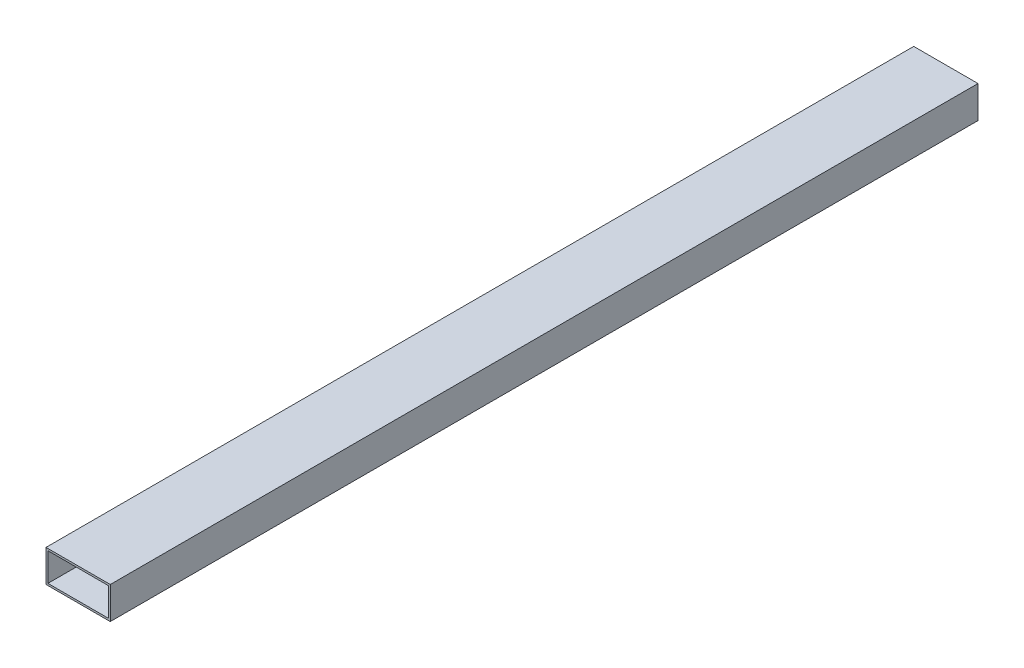
ISO-10303-21;
HEADER;
FILE_DESCRIPTION(('STEP AP214'),'2;1');
FILE_NAME('part.step','',(''),(''),'','','');
FILE_SCHEMA(('AUTOMOTIVE_DESIGN { 1 0 10303 214 1 1 1 1 }'));
ENDSEC;
DATA;
#1=APPLICATION_CONTEXT('core data for automotive mechanical design processes');
#2=APPLICATION_PROTOCOL_DEFINITION('international standard','automotive_design',2000,#1);
#3=PRODUCT_CONTEXT('',#1,'mechanical');
#4=PRODUCT('Part','Part','',(#3));
#5=PRODUCT_RELATED_PRODUCT_CATEGORY('part','',(#4));
#6=PRODUCT_DEFINITION_FORMATION('','',#4);
#7=PRODUCT_DEFINITION_CONTEXT('part definition',#1,'design');
#8=PRODUCT_DEFINITION('design','',#6,#7);
#9=PRODUCT_DEFINITION_SHAPE('','',#8);
#10=(LENGTH_UNIT() NAMED_UNIT(*) SI_UNIT(.MILLI.,.METRE.));
#11=(NAMED_UNIT(*) PLANE_ANGLE_UNIT() SI_UNIT($,.RADIAN.));
#12=(NAMED_UNIT(*) SI_UNIT($,.STERADIAN.) SOLID_ANGLE_UNIT());
#13=UNCERTAINTY_MEASURE_WITH_UNIT(LENGTH_MEASURE(1.E-05),#10,'distance_accuracy_value','');
#14=(GEOMETRIC_REPRESENTATION_CONTEXT(3) GLOBAL_UNCERTAINTY_ASSIGNED_CONTEXT((#13)) GLOBAL_UNIT_ASSIGNED_CONTEXT((#10,
#11,#12)) REPRESENTATION_CONTEXT('',''));
#15=CARTESIAN_POINT('',(0.,0.,0.));
#16=DIRECTION('',(0.,0.,1.));
#17=DIRECTION('',(1.,0.,0.));
#18=AXIS2_PLACEMENT_3D('',#15,#16,#17);
#19=CARTESIAN_POINT('',(0.,0.,685.8));
#20=DIRECTION('',(0.,0.,1.));
#21=DIRECTION('',(1.,0.,0.));
#22=AXIS2_PLACEMENT_3D('',#19,#20,#21);
#23=PLANE('',#22);
#24=DIRECTION('',(0.,1.,0.));
#25=VECTOR('',#24,1.);
#26=CARTESIAN_POINT('',(0.,0.,685.8));
#27=LINE('',#26,#25);
#28=CARTESIAN_POINT('',(0.,0.,685.8));
#29=VERTEX_POINT('',#28);
#30=CARTESIAN_POINT('',(0.,25.4,685.8));
#31=VERTEX_POINT('',#30);
#32=EDGE_CURVE('E162',#29,#31,#27,.T.);
#33=ORIENTED_EDGE('',*,*,#32,.T.);
#34=DIRECTION('',(-1.,0.,0.));
#35=VECTOR('',#34,1.);
#36=CARTESIAN_POINT('',(0.,25.4,685.8));
#37=LINE('',#36,#35);
#38=CARTESIAN_POINT('',(-50.8,25.4,685.8));
#39=VERTEX_POINT('',#38);
#40=EDGE_CURVE('E165',#31,#39,#37,.T.);
#41=ORIENTED_EDGE('',*,*,#40,.T.);
#42=DIRECTION('',(0.,-1.,0.));
#43=VECTOR('',#42,1.);
#44=CARTESIAN_POINT('',(-50.8,0.,685.8));
#45=LINE('',#44,#43);
#46=CARTESIAN_POINT('',(-50.8,0.,685.8));
#47=VERTEX_POINT('',#46);
#48=EDGE_CURVE('E168',#39,#47,#45,.T.);
#49=ORIENTED_EDGE('',*,*,#48,.T.);
#50=DIRECTION('',(1.,0.,0.));
#51=VECTOR('',#50,1.);
#52=CARTESIAN_POINT('',(0.,0.,685.8));
#53=LINE('',#52,#51);
#54=EDGE_CURVE('E170',#47,#29,#53,.T.);
#55=ORIENTED_EDGE('',*,*,#54,.T.);
#56=EDGE_LOOP('',(#33,#41,#49,#55));
#57=FACE_BOUND('',#56,.T.);
#58=DIRECTION('',(-1.,0.,0.));
#59=VECTOR('',#58,1.);
#60=CARTESIAN_POINT('',(0.,23.876,685.8));
#61=LINE('',#60,#59);
#62=CARTESIAN_POINT('',(-1.524,23.876,685.8));
#63=VERTEX_POINT('',#62);
#64=CARTESIAN_POINT('',(-49.276,23.876,685.8));
#65=VERTEX_POINT('',#64);
#66=EDGE_CURVE('E134',#63,#65,#61,.T.);
#67=ORIENTED_EDGE('',*,*,#66,.F.);
#68=DIRECTION('',(0.,1.,0.));
#69=VECTOR('',#68,1.);
#70=CARTESIAN_POINT('',(-1.524,0.,685.8));
#71=LINE('',#70,#69);
#72=CARTESIAN_POINT('',(-1.524,1.524,685.8));
#73=VERTEX_POINT('',#72);
#74=EDGE_CURVE('E126',#73,#63,#71,.T.);
#75=ORIENTED_EDGE('',*,*,#74,.F.);
#76=DIRECTION('',(1.,0.,0.));
#77=VECTOR('',#76,1.);
#78=CARTESIAN_POINT('',(0.,1.524,685.8));
#79=LINE('',#78,#77);
#80=CARTESIAN_POINT('',(-49.276,1.524,685.8));
#81=VERTEX_POINT('',#80);
#82=EDGE_CURVE('E148',#81,#73,#79,.T.);
#83=ORIENTED_EDGE('',*,*,#82,.F.);
#84=DIRECTION('',(0.,-1.,0.));
#85=VECTOR('',#84,1.);
#86=CARTESIAN_POINT('',(-49.276,0.,685.8));
#87=LINE('',#86,#85);
#88=EDGE_CURVE('E146',#65,#81,#87,.T.);
#89=ORIENTED_EDGE('',*,*,#88,.F.);
#90=EDGE_LOOP('',(#67,#75,#83,#89));
#91=FACE_BOUND('',#90,.T.);
#92=ADVANCED_FACE('F61',(#57,#91),#23,.T.);
#93=CARTESIAN_POINT('',(0.,0.,0.));
#94=DIRECTION('',(0.,0.,1.));
#95=DIRECTION('',(1.,0.,0.));
#96=AXIS2_PLACEMENT_3D('',#93,#94,#95);
#97=PLANE('',#96);
#98=DIRECTION('',(0.,1.,0.));
#99=VECTOR('',#98,1.);
#100=CARTESIAN_POINT('',(0.,0.,0.));
#101=LINE('',#100,#99);
#102=CARTESIAN_POINT('',(0.,0.,0.));
#103=VERTEX_POINT('',#102);
#104=CARTESIAN_POINT('',(0.,25.4,0.));
#105=VERTEX_POINT('',#104);
#106=EDGE_CURVE('E142',#103,#105,#101,.T.);
#107=ORIENTED_EDGE('',*,*,#106,.F.);
#108=DIRECTION('',(1.,0.,0.));
#109=VECTOR('',#108,1.);
#110=CARTESIAN_POINT('',(0.,0.,0.));
#111=LINE('',#110,#109);
#112=CARTESIAN_POINT('',(-50.8,0.,0.));
#113=VERTEX_POINT('',#112);
#114=EDGE_CURVE('E166',#113,#103,#111,.T.);
#115=ORIENTED_EDGE('',*,*,#114,.F.);
#116=DIRECTION('',(0.,-1.,0.));
#117=VECTOR('',#116,1.);
#118=CARTESIAN_POINT('',(-50.8,0.,0.));
#119=LINE('',#118,#117);
#120=CARTESIAN_POINT('',(-50.8,25.4,0.));
#121=VERTEX_POINT('',#120);
#122=EDGE_CURVE('E177',#121,#113,#119,.T.);
#123=ORIENTED_EDGE('',*,*,#122,.F.);
#124=DIRECTION('',(-1.,0.,0.));
#125=VECTOR('',#124,1.);
#126=CARTESIAN_POINT('',(0.,25.4,0.));
#127=LINE('',#126,#125);
#128=EDGE_CURVE('E175',#105,#121,#127,.T.);
#129=ORIENTED_EDGE('',*,*,#128,.F.);
#130=EDGE_LOOP('',(#107,#115,#123,#129));
#131=FACE_BOUND('',#130,.T.);
#132=DIRECTION('',(0.,1.,0.));
#133=VECTOR('',#132,1.);
#134=CARTESIAN_POINT('',(-1.524,0.,0.));
#135=LINE('',#134,#133);
#136=CARTESIAN_POINT('',(-1.524,1.524,0.));
#137=VERTEX_POINT('',#136);
#138=CARTESIAN_POINT('',(-1.524,23.876,0.));
#139=VERTEX_POINT('',#138);
#140=EDGE_CURVE('E84',#137,#139,#135,.T.);
#141=ORIENTED_EDGE('',*,*,#140,.T.);
#142=DIRECTION('',(-1.,0.,0.));
#143=VECTOR('',#142,1.);
#144=CARTESIAN_POINT('',(0.,23.876,0.));
#145=LINE('',#144,#143);
#146=CARTESIAN_POINT('',(-49.276,23.876,0.));
#147=VERTEX_POINT('',#146);
#148=EDGE_CURVE('E141',#139,#147,#145,.T.);
#149=ORIENTED_EDGE('',*,*,#148,.T.);
#150=DIRECTION('',(0.,-1.,0.));
#151=VECTOR('',#150,1.);
#152=CARTESIAN_POINT('',(-49.276,0.,0.));
#153=LINE('',#152,#151);
#154=CARTESIAN_POINT('',(-49.276,1.524,0.));
#155=VERTEX_POINT('',#154);
#156=EDGE_CURVE('E154',#147,#155,#153,.T.);
#157=ORIENTED_EDGE('',*,*,#156,.T.);
#158=DIRECTION('',(1.,0.,0.));
#159=VECTOR('',#158,1.);
#160=CARTESIAN_POINT('',(0.,1.524,0.));
#161=LINE('',#160,#159);
#162=EDGE_CURVE('E135',#155,#137,#161,.T.);
#163=ORIENTED_EDGE('',*,*,#162,.T.);
#164=EDGE_LOOP('',(#141,#149,#157,#163));
#165=FACE_BOUND('',#164,.T.);
#166=ADVANCED_FACE('F195',(#131,#165),#97,.F.);
#167=CARTESIAN_POINT('',(0.,0.,685.8));
#168=DIRECTION('',(-1.,0.,0.));
#169=DIRECTION('',(0.,-1.,0.));
#170=AXIS2_PLACEMENT_3D('',#167,#168,#169);
#171=PLANE('',#170);
#172=ORIENTED_EDGE('',*,*,#106,.T.);
#173=DIRECTION('',(0.,0.,-1.));
#174=VECTOR('',#173,1.);
#175=CARTESIAN_POINT('',(0.,25.4,685.8));
#176=LINE('',#175,#174);
#177=EDGE_CURVE('E12',#31,#105,#176,.T.);
#178=ORIENTED_EDGE('',*,*,#177,.F.);
#179=ORIENTED_EDGE('',*,*,#32,.F.);
#180=DIRECTION('',(0.,0.,-1.));
#181=VECTOR('',#180,1.);
#182=CARTESIAN_POINT('',(0.,0.,685.8));
#183=LINE('',#182,#181);
#184=EDGE_CURVE('E172',#29,#103,#183,.T.);
#185=ORIENTED_EDGE('',*,*,#184,.T.);
#186=EDGE_LOOP('',(#172,#178,#179,#185));
#187=FACE_BOUND('',#186,.T.);
#188=ADVANCED_FACE('F63',(#187),#171,.F.);
#189=CARTESIAN_POINT('',(0.,25.4,685.8));
#190=DIRECTION('',(0.,-1.,0.));
#191=DIRECTION('',(1.,0.,0.));
#192=AXIS2_PLACEMENT_3D('',#189,#190,#191);
#193=PLANE('',#192);
#194=ORIENTED_EDGE('',*,*,#128,.T.);
#195=DIRECTION('',(0.,0.,-1.));
#196=VECTOR('',#195,1.);
#197=CARTESIAN_POINT('',(-50.8,25.4,685.8));
#198=LINE('',#197,#196);
#199=EDGE_CURVE('E69',#39,#121,#198,.T.);
#200=ORIENTED_EDGE('',*,*,#199,.F.);
#201=ORIENTED_EDGE('',*,*,#40,.F.);
#202=ORIENTED_EDGE('',*,*,#177,.T.);
#203=EDGE_LOOP('',(#194,#200,#201,#202));
#204=FACE_BOUND('',#203,.T.);
#205=ADVANCED_FACE('F205',(#204),#193,.F.);
#206=CARTESIAN_POINT('',(-50.8,0.,685.8));
#207=DIRECTION('',(1.,0.,0.));
#208=DIRECTION('',(0.,0.,-1.));
#209=AXIS2_PLACEMENT_3D('',#206,#207,#208);
#210=PLANE('',#209);
#211=ORIENTED_EDGE('',*,*,#122,.T.);
#212=DIRECTION('',(0.,0.,-1.));
#213=VECTOR('',#212,1.);
#214=CARTESIAN_POINT('',(-50.8,0.,685.8));
#215=LINE('',#214,#213);
#216=EDGE_CURVE('E182',#47,#113,#215,.T.);
#217=ORIENTED_EDGE('',*,*,#216,.F.);
#218=ORIENTED_EDGE('',*,*,#48,.F.);
#219=ORIENTED_EDGE('',*,*,#199,.T.);
#220=EDGE_LOOP('',(#211,#217,#218,#219));
#221=FACE_BOUND('',#220,.T.);
#222=ADVANCED_FACE('F189',(#221),#210,.F.);
#223=CARTESIAN_POINT('',(0.,0.,685.8));
#224=DIRECTION('',(0.,1.,0.));
#225=DIRECTION('',(0.,0.,1.));
#226=AXIS2_PLACEMENT_3D('',#223,#224,#225);
#227=PLANE('',#226);
#228=ORIENTED_EDGE('',*,*,#114,.T.);
#229=ORIENTED_EDGE('',*,*,#184,.F.);
#230=ORIENTED_EDGE('',*,*,#54,.F.);
#231=ORIENTED_EDGE('',*,*,#216,.T.);
#232=EDGE_LOOP('',(#228,#229,#230,#231));
#233=FACE_BOUND('',#232,.T.);
#234=ADVANCED_FACE('F199',(#233),#227,.F.);
#235=CARTESIAN_POINT('',(-1.524,0.,685.8));
#236=DIRECTION('',(-1.,0.,0.));
#237=DIRECTION('',(0.,-1.,0.));
#238=AXIS2_PLACEMENT_3D('',#235,#236,#237);
#239=PLANE('',#238);
#240=ORIENTED_EDGE('',*,*,#140,.F.);
#241=DIRECTION('',(0.,0.,-1.));
#242=VECTOR('',#241,1.);
#243=CARTESIAN_POINT('',(-1.524,1.524,685.8));
#244=LINE('',#243,#242);
#245=EDGE_CURVE('E130',#73,#137,#244,.T.);
#246=ORIENTED_EDGE('',*,*,#245,.F.);
#247=ORIENTED_EDGE('',*,*,#74,.T.);
#248=DIRECTION('',(0.,0.,-1.));
#249=VECTOR('',#248,1.);
#250=CARTESIAN_POINT('',(-1.524,23.876,685.8));
#251=LINE('',#250,#249);
#252=EDGE_CURVE('E129',#63,#139,#251,.T.);
#253=ORIENTED_EDGE('',*,*,#252,.T.);
#254=EDGE_LOOP('',(#240,#246,#247,#253));
#255=FACE_BOUND('',#254,.T.);
#256=ADVANCED_FACE('F128',(#255),#239,.T.);
#257=CARTESIAN_POINT('',(0.,23.876,685.8));
#258=DIRECTION('',(0.,-1.,0.));
#259=DIRECTION('',(1.,0.,0.));
#260=AXIS2_PLACEMENT_3D('',#257,#258,#259);
#261=PLANE('',#260);
#262=ORIENTED_EDGE('',*,*,#148,.F.);
#263=ORIENTED_EDGE('',*,*,#252,.F.);
#264=ORIENTED_EDGE('',*,*,#66,.T.);
#265=DIRECTION('',(0.,0.,-1.));
#266=VECTOR('',#265,1.);
#267=CARTESIAN_POINT('',(-49.276,23.876,685.8));
#268=LINE('',#267,#266);
#269=EDGE_CURVE('E143',#65,#147,#268,.T.);
#270=ORIENTED_EDGE('',*,*,#269,.T.);
#271=EDGE_LOOP('',(#262,#263,#264,#270));
#272=FACE_BOUND('',#271,.T.);
#273=ADVANCED_FACE('F138',(#272),#261,.T.);
#274=CARTESIAN_POINT('',(-49.276,0.,685.8));
#275=DIRECTION('',(1.,0.,0.));
#276=DIRECTION('',(0.,0.,-1.));
#277=AXIS2_PLACEMENT_3D('',#274,#275,#276);
#278=PLANE('',#277);
#279=ORIENTED_EDGE('',*,*,#156,.F.);
#280=ORIENTED_EDGE('',*,*,#269,.F.);
#281=ORIENTED_EDGE('',*,*,#88,.T.);
#282=DIRECTION('',(0.,0.,-1.));
#283=VECTOR('',#282,1.);
#284=CARTESIAN_POINT('',(-49.276,1.524,685.8));
#285=LINE('',#284,#283);
#286=EDGE_CURVE('E76',#81,#155,#285,.T.);
#287=ORIENTED_EDGE('',*,*,#286,.T.);
#288=EDGE_LOOP('',(#279,#280,#281,#287));
#289=FACE_BOUND('',#288,.T.);
#290=ADVANCED_FACE('F228',(#289),#278,.T.);
#291=CARTESIAN_POINT('',(0.,1.524,685.8));
#292=DIRECTION('',(0.,1.,0.));
#293=DIRECTION('',(0.,0.,1.));
#294=AXIS2_PLACEMENT_3D('',#291,#292,#293);
#295=PLANE('',#294);
#296=ORIENTED_EDGE('',*,*,#162,.F.);
#297=ORIENTED_EDGE('',*,*,#286,.F.);
#298=ORIENTED_EDGE('',*,*,#82,.T.);
#299=ORIENTED_EDGE('',*,*,#245,.T.);
#300=EDGE_LOOP('',(#296,#297,#298,#299));
#301=FACE_BOUND('',#300,.T.);
#302=ADVANCED_FACE('F232',(#301),#295,.T.);
#303=CLOSED_SHELL('',(#92,#166,#188,#205,#222,#234,#256,#273,#290,#302));
#304=MANIFOLD_SOLID_BREP('B2',#303);
#305=ADVANCED_BREP_SHAPE_REPRESENTATION('',(#18,#304),#14);
#306=SHAPE_DEFINITION_REPRESENTATION(#9,#305);
ENDSEC;
END-ISO-10303-21;
